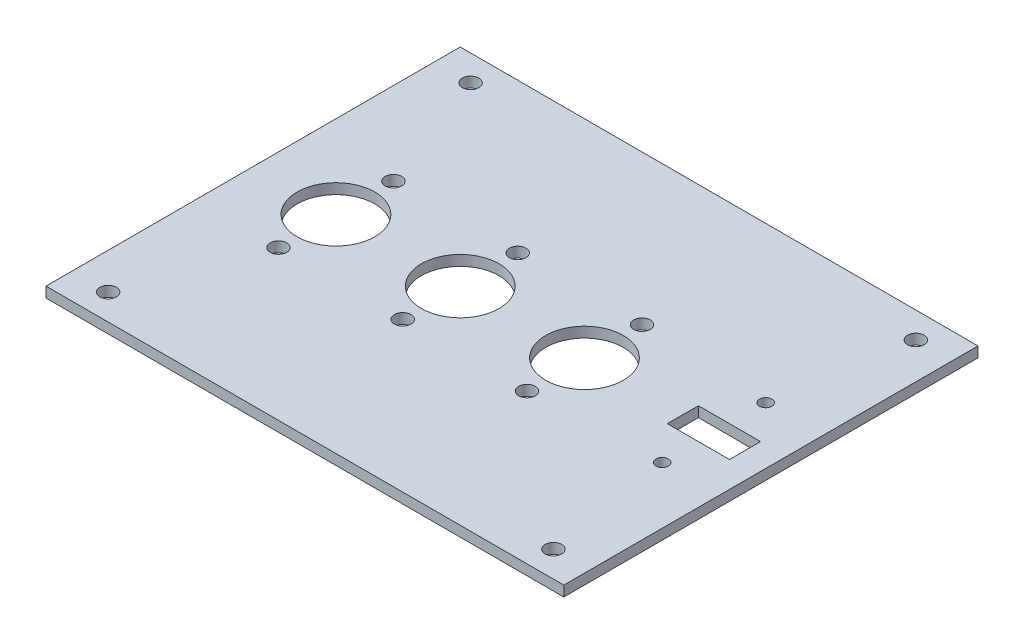
ISO-10303-21;
HEADER;
FILE_DESCRIPTION(('STEP AP214'),'2;1');
FILE_NAME('part.step','',(''),(''),'','','');
FILE_SCHEMA(('AUTOMOTIVE_DESIGN { 1 0 10303 214 1 1 1 1 }'));
ENDSEC;
DATA;
#1=APPLICATION_CONTEXT('core data for automotive mechanical design processes');
#2=APPLICATION_PROTOCOL_DEFINITION('international standard','automotive_design',2000,#1);
#3=PRODUCT_CONTEXT('',#1,'mechanical');
#4=PRODUCT('Part','Part','',(#3));
#5=PRODUCT_RELATED_PRODUCT_CATEGORY('part','',(#4));
#6=PRODUCT_DEFINITION_FORMATION('','',#4);
#7=PRODUCT_DEFINITION_CONTEXT('part definition',#1,'design');
#8=PRODUCT_DEFINITION('design','',#6,#7);
#9=PRODUCT_DEFINITION_SHAPE('','',#8);
#10=(LENGTH_UNIT() NAMED_UNIT(*) SI_UNIT(.MILLI.,.METRE.));
#11=(NAMED_UNIT(*) PLANE_ANGLE_UNIT() SI_UNIT($,.RADIAN.));
#12=(NAMED_UNIT(*) SI_UNIT($,.STERADIAN.) SOLID_ANGLE_UNIT());
#13=UNCERTAINTY_MEASURE_WITH_UNIT(LENGTH_MEASURE(1.E-05),#10,'distance_accuracy_value','');
#14=(GEOMETRIC_REPRESENTATION_CONTEXT(3) GLOBAL_UNCERTAINTY_ASSIGNED_CONTEXT((#13)) GLOBAL_UNIT_ASSIGNED_CONTEXT((#10,
#11,#12)) REPRESENTATION_CONTEXT('',''));
#15=CARTESIAN_POINT('',(0.,0.,0.));
#16=DIRECTION('',(0.,0.,1.));
#17=DIRECTION('',(1.,0.,0.));
#18=AXIS2_PLACEMENT_3D('',#15,#16,#17);
#19=CARTESIAN_POINT('',(0.,0.,80.));
#20=DIRECTION('',(0.,0.,1.));
#21=DIRECTION('',(1.,0.,0.));
#22=AXIS2_PLACEMENT_3D('',#19,#20,#21);
#23=PLANE('',#22);
#24=DIRECTION('',(-1.,0.,0.));
#25=VECTOR('',#24,1.);
#26=CARTESIAN_POINT('',(0.,-1.,80.));
#27=LINE('',#26,#25);
#28=CARTESIAN_POINT('',(50.,-1.,80.));
#29=VERTEX_POINT('',#28);
#30=CARTESIAN_POINT('',(-50.,-1.,80.));
#31=VERTEX_POINT('',#30);
#32=EDGE_CURVE('E84',#29,#31,#27,.T.);
#33=ORIENTED_EDGE('',*,*,#32,.F.);
#34=DIRECTION('',(0.,-1.,0.));
#35=VECTOR('',#34,1.);
#36=CARTESIAN_POINT('',(50.,0.,80.));
#37=LINE('',#36,#35);
#38=CARTESIAN_POINT('',(50.,1.,80.));
#39=VERTEX_POINT('',#38);
#40=EDGE_CURVE('E211',#39,#29,#37,.T.);
#41=ORIENTED_EDGE('',*,*,#40,.F.);
#42=DIRECTION('',(1.,0.,0.));
#43=VECTOR('',#42,1.);
#44=CARTESIAN_POINT('',(0.,1.,80.));
#45=LINE('',#44,#43);
#46=CARTESIAN_POINT('',(-50.,1.,80.));
#47=VERTEX_POINT('',#46);
#48=EDGE_CURVE('E214',#47,#39,#45,.T.);
#49=ORIENTED_EDGE('',*,*,#48,.F.);
#50=DIRECTION('',(0.,1.,0.));
#51=VECTOR('',#50,1.);
#52=CARTESIAN_POINT('',(-50.,0.,80.));
#53=LINE('',#52,#51);
#54=EDGE_CURVE('E216',#31,#47,#53,.T.);
#55=ORIENTED_EDGE('',*,*,#54,.F.);
#56=EDGE_LOOP('',(#33,#41,#49,#55));
#57=FACE_BOUND('',#56,.T.);
#58=ADVANCED_FACE('F16',(#57),#23,.T.);
#59=CARTESIAN_POINT('',(0.,-1.,0.));
#60=DIRECTION('',(0.,-1.,0.));
#61=DIRECTION('',(0.,0.,-1.));
#62=AXIS2_PLACEMENT_3D('',#59,#60,#61);
#63=PLANE('',#62);
#64=CARTESIAN_POINT('',(43.,-1.,75.));
#65=DIRECTION('',(0.,-1.,0.));
#66=DIRECTION('',(0.,0.,-1.));
#67=AXIS2_PLACEMENT_3D('',#64,#65,#66);
#68=CIRCLE('',#67,1.6);
#69=CARTESIAN_POINT('',(43.,-1.,73.4));
#70=VERTEX_POINT('',#69);
#71=EDGE_CURVE('E120',#70,#70,#68,.T.);
#72=ORIENTED_EDGE('',*,*,#71,.F.);
#73=EDGE_LOOP('',(#72));
#74=FACE_BOUND('',#73,.T.);
#75=CARTESIAN_POINT('',(43.,-1.,5.));
#76=DIRECTION('',(0.,-1.,0.));
#77=DIRECTION('',(0.,0.,-1.));
#78=AXIS2_PLACEMENT_3D('',#75,#76,#77);
#79=CIRCLE('',#78,1.6);
#80=CARTESIAN_POINT('',(43.,-1.,3.4));
#81=VERTEX_POINT('',#80);
#82=EDGE_CURVE('E117',#81,#81,#79,.T.);
#83=ORIENTED_EDGE('',*,*,#82,.F.);
#84=EDGE_LOOP('',(#83));
#85=FACE_BOUND('',#84,.T.);
#86=CARTESIAN_POINT('',(-43.,-1.,75.));
#87=DIRECTION('',(0.,-1.,0.));
#88=DIRECTION('',(0.,0.,-1.));
#89=AXIS2_PLACEMENT_3D('',#86,#87,#88);
#90=CIRCLE('',#89,1.6);
#91=CARTESIAN_POINT('',(-43.,-1.,73.4));
#92=VERTEX_POINT('',#91);
#93=EDGE_CURVE('E114',#92,#92,#90,.T.);
#94=ORIENTED_EDGE('',*,*,#93,.F.);
#95=EDGE_LOOP('',(#94));
#96=FACE_BOUND('',#95,.T.);
#97=CARTESIAN_POINT('',(-43.,-1.,5.));
#98=DIRECTION('',(0.,-1.,0.));
#99=DIRECTION('',(0.,0.,-1.));
#100=AXIS2_PLACEMENT_3D('',#97,#98,#99);
#101=CIRCLE('',#100,1.6);
#102=CARTESIAN_POINT('',(-43.,-1.,3.4));
#103=VERTEX_POINT('',#102);
#104=EDGE_CURVE('E110',#103,#103,#101,.T.);
#105=ORIENTED_EDGE('',*,*,#104,.F.);
#106=EDGE_LOOP('',(#105));
#107=FACE_BOUND('',#106,.T.);
#108=CARTESIAN_POINT('',(39.,-1.,50.));
#109=DIRECTION('',(0.,-1.,0.));
#110=DIRECTION('',(0.,0.,-1.));
#111=AXIS2_PLACEMENT_3D('',#108,#109,#110);
#112=CIRCLE('',#111,1.2);
#113=CARTESIAN_POINT('',(39.,-1.,48.8));
#114=VERTEX_POINT('',#113);
#115=EDGE_CURVE('E106',#114,#114,#112,.T.);
#116=ORIENTED_EDGE('',*,*,#115,.F.);
#117=EDGE_LOOP('',(#116));
#118=FACE_BOUND('',#117,.T.);
#119=CARTESIAN_POINT('',(39.,-1.,30.));
#120=DIRECTION('',(0.,-1.,0.));
#121=DIRECTION('',(0.,0.,-1.));
#122=AXIS2_PLACEMENT_3D('',#119,#120,#121);
#123=CIRCLE('',#122,1.2);
#124=CARTESIAN_POINT('',(39.,-1.,28.8));
#125=VERTEX_POINT('',#124);
#126=EDGE_CURVE('E105',#125,#125,#123,.T.);
#127=ORIENTED_EDGE('',*,*,#126,.F.);
#128=EDGE_LOOP('',(#127));
#129=FACE_BOUND('',#128,.T.);
#130=DIRECTION('',(-1.,0.,0.));
#131=VECTOR('',#130,1.);
#132=CARTESIAN_POINT('',(0.,-1.,43.));
#133=LINE('',#132,#131);
#134=CARTESIAN_POINT('',(45.,-1.,43.));
#135=VERTEX_POINT('',#134);
#136=CARTESIAN_POINT('',(33.,-1.,43.));
#137=VERTEX_POINT('',#136);
#138=EDGE_CURVE('E149',#135,#137,#133,.T.);
#139=ORIENTED_EDGE('',*,*,#138,.F.);
#140=DIRECTION('',(0.,0.,1.));
#141=VECTOR('',#140,1.);
#142=CARTESIAN_POINT('',(45.,-1.,0.));
#143=LINE('',#142,#141);
#144=CARTESIAN_POINT('',(45.,-1.,37.));
#145=VERTEX_POINT('',#144);
#146=EDGE_CURVE('E144',#145,#135,#143,.T.);
#147=ORIENTED_EDGE('',*,*,#146,.F.);
#148=DIRECTION('',(1.,0.,0.));
#149=VECTOR('',#148,1.);
#150=CARTESIAN_POINT('',(0.,-1.,37.));
#151=LINE('',#150,#149);
#152=CARTESIAN_POINT('',(33.,-1.,37.));
#153=VERTEX_POINT('',#152);
#154=EDGE_CURVE('E91',#153,#145,#151,.T.);
#155=ORIENTED_EDGE('',*,*,#154,.F.);
#156=DIRECTION('',(0.,0.,-1.));
#157=VECTOR('',#156,1.);
#158=CARTESIAN_POINT('',(33.,-1.,0.));
#159=LINE('',#158,#157);
#160=EDGE_CURVE('E147',#137,#153,#159,.T.);
#161=ORIENTED_EDGE('',*,*,#160,.F.);
#162=EDGE_LOOP('',(#139,#147,#155,#161));
#163=FACE_BOUND('',#162,.T.);
#164=CARTESIAN_POINT('',(14.,-1.,51.1));
#165=DIRECTION('',(0.,-1.,0.));
#166=DIRECTION('',(0.,0.,-1.));
#167=AXIS2_PLACEMENT_3D('',#164,#165,#166);
#168=CIRCLE('',#167,1.6);
#169=CARTESIAN_POINT('',(14.,-1.,49.5));
#170=VERTEX_POINT('',#169);
#171=EDGE_CURVE('E152',#170,#170,#168,.T.);
#172=ORIENTED_EDGE('',*,*,#171,.F.);
#173=EDGE_LOOP('',(#172));
#174=FACE_BOUND('',#173,.T.);
#175=CARTESIAN_POINT('',(14.,-1.,28.9));
#176=DIRECTION('',(0.,-1.,0.));
#177=DIRECTION('',(0.,0.,-1.));
#178=AXIS2_PLACEMENT_3D('',#175,#176,#177);
#179=CIRCLE('',#178,1.6);
#180=CARTESIAN_POINT('',(14.,-1.,27.3));
#181=VERTEX_POINT('',#180);
#182=EDGE_CURVE('E156',#181,#181,#179,.T.);
#183=ORIENTED_EDGE('',*,*,#182,.F.);
#184=EDGE_LOOP('',(#183));
#185=FACE_BOUND('',#184,.T.);
#186=CARTESIAN_POINT('',(14.,-1.,40.));
#187=DIRECTION('',(0.,-1.,0.));
#188=DIRECTION('',(0.,0.,-1.));
#189=AXIS2_PLACEMENT_3D('',#186,#187,#188);
#190=CIRCLE('',#189,7.5);
#191=CARTESIAN_POINT('',(14.,-1.,32.5));
#192=VERTEX_POINT('',#191);
#193=EDGE_CURVE('E160',#192,#192,#190,.T.);
#194=ORIENTED_EDGE('',*,*,#193,.F.);
#195=EDGE_LOOP('',(#194));
#196=FACE_BOUND('',#195,.T.);
#197=CARTESIAN_POINT('',(-10.,-1.,51.1));
#198=DIRECTION('',(0.,-1.,0.));
#199=DIRECTION('',(0.,0.,-1.));
#200=AXIS2_PLACEMENT_3D('',#197,#198,#199);
#201=CIRCLE('',#200,1.6);
#202=CARTESIAN_POINT('',(-10.,-1.,49.5));
#203=VERTEX_POINT('',#202);
#204=EDGE_CURVE('E164',#203,#203,#201,.T.);
#205=ORIENTED_EDGE('',*,*,#204,.F.);
#206=EDGE_LOOP('',(#205));
#207=FACE_BOUND('',#206,.T.);
#208=CARTESIAN_POINT('',(-10.,-1.,28.9));
#209=DIRECTION('',(0.,-1.,0.));
#210=DIRECTION('',(0.,0.,-1.));
#211=AXIS2_PLACEMENT_3D('',#208,#209,#210);
#212=CIRCLE('',#211,1.6);
#213=CARTESIAN_POINT('',(-10.,-1.,27.3));
#214=VERTEX_POINT('',#213);
#215=EDGE_CURVE('E168',#214,#214,#212,.T.);
#216=ORIENTED_EDGE('',*,*,#215,.F.);
#217=EDGE_LOOP('',(#216));
#218=FACE_BOUND('',#217,.T.);
#219=CARTESIAN_POINT('',(-10.,-1.,40.));
#220=DIRECTION('',(0.,-1.,0.));
#221=DIRECTION('',(0.,0.,-1.));
#222=AXIS2_PLACEMENT_3D('',#219,#220,#221);
#223=CIRCLE('',#222,7.5);
#224=CARTESIAN_POINT('',(-10.,-1.,32.5));
#225=VERTEX_POINT('',#224);
#226=EDGE_CURVE('E172',#225,#225,#223,.T.);
#227=ORIENTED_EDGE('',*,*,#226,.F.);
#228=EDGE_LOOP('',(#227));
#229=FACE_BOUND('',#228,.T.);
#230=CARTESIAN_POINT('',(-34.,-1.,51.1));
#231=DIRECTION('',(0.,-1.,0.));
#232=DIRECTION('',(0.,0.,-1.));
#233=AXIS2_PLACEMENT_3D('',#230,#231,#232);
#234=CIRCLE('',#233,1.6);
#235=CARTESIAN_POINT('',(-34.,-1.,49.5));
#236=VERTEX_POINT('',#235);
#237=EDGE_CURVE('E176',#236,#236,#234,.T.);
#238=ORIENTED_EDGE('',*,*,#237,.F.);
#239=EDGE_LOOP('',(#238));
#240=FACE_BOUND('',#239,.T.);
#241=CARTESIAN_POINT('',(-34.,-1.,28.9));
#242=DIRECTION('',(0.,-1.,0.));
#243=DIRECTION('',(0.,0.,-1.));
#244=AXIS2_PLACEMENT_3D('',#241,#242,#243);
#245=CIRCLE('',#244,1.6);
#246=CARTESIAN_POINT('',(-34.,-1.,27.3));
#247=VERTEX_POINT('',#246);
#248=EDGE_CURVE('E180',#247,#247,#245,.T.);
#249=ORIENTED_EDGE('',*,*,#248,.F.);
#250=EDGE_LOOP('',(#249));
#251=FACE_BOUND('',#250,.T.);
#252=CARTESIAN_POINT('',(-34.,-1.,40.));
#253=DIRECTION('',(0.,-1.,0.));
#254=DIRECTION('',(0.,0.,-1.));
#255=AXIS2_PLACEMENT_3D('',#252,#253,#254);
#256=CIRCLE('',#255,7.5);
#257=CARTESIAN_POINT('',(-34.,-1.,32.5));
#258=VERTEX_POINT('',#257);
#259=EDGE_CURVE('E184',#258,#258,#256,.T.);
#260=ORIENTED_EDGE('',*,*,#259,.F.);
#261=EDGE_LOOP('',(#260));
#262=FACE_BOUND('',#261,.T.);
#263=DIRECTION('',(0.,0.,1.));
#264=VECTOR('',#263,1.);
#265=CARTESIAN_POINT('',(50.,-1.,0.));
#266=LINE('',#265,#264);
#267=CARTESIAN_POINT('',(50.,-1.,0.));
#268=VERTEX_POINT('',#267);
#269=EDGE_CURVE('E194',#268,#29,#266,.T.);
#270=ORIENTED_EDGE('',*,*,#269,.T.);
#271=ORIENTED_EDGE('',*,*,#32,.T.);
#272=DIRECTION('',(0.,0.,1.));
#273=VECTOR('',#272,1.);
#274=CARTESIAN_POINT('',(-50.,-1.,0.));
#275=LINE('',#274,#273);
#276=CARTESIAN_POINT('',(-50.,-1.,0.));
#277=VERTEX_POINT('',#276);
#278=EDGE_CURVE('E208',#277,#31,#275,.T.);
#279=ORIENTED_EDGE('',*,*,#278,.F.);
#280=DIRECTION('',(1.,0.,0.));
#281=VECTOR('',#280,1.);
#282=CARTESIAN_POINT('',(0.,-1.,0.));
#283=LINE('',#282,#281);
#284=EDGE_CURVE('E187',#277,#268,#283,.T.);
#285=ORIENTED_EDGE('',*,*,#284,.T.);
#286=EDGE_LOOP('',(#270,#271,#279,#285));
#287=FACE_BOUND('',#286,.T.);
#288=ADVANCED_FACE('F273',(#74,#85,#96,#107,#118,#129,#163,#174,#185,#196,#207,#218,#229,#240,
#251,#262,#287),#63,.T.);
#289=CARTESIAN_POINT('',(-50.,0.,0.));
#290=DIRECTION('',(-1.,0.,0.));
#291=DIRECTION('',(0.,0.,1.));
#292=AXIS2_PLACEMENT_3D('',#289,#290,#291);
#293=PLANE('',#292);
#294=ORIENTED_EDGE('',*,*,#278,.T.);
#295=ORIENTED_EDGE('',*,*,#54,.T.);
#296=DIRECTION('',(0.,0.,1.));
#297=VECTOR('',#296,1.);
#298=CARTESIAN_POINT('',(-50.,1.,0.));
#299=LINE('',#298,#297);
#300=CARTESIAN_POINT('',(-50.,1.,0.));
#301=VERTEX_POINT('',#300);
#302=EDGE_CURVE('E205',#301,#47,#299,.T.);
#303=ORIENTED_EDGE('',*,*,#302,.F.);
#304=DIRECTION('',(0.,-1.,0.));
#305=VECTOR('',#304,1.);
#306=CARTESIAN_POINT('',(-50.,0.,0.));
#307=LINE('',#306,#305);
#308=EDGE_CURVE('E190',#301,#277,#307,.T.);
#309=ORIENTED_EDGE('',*,*,#308,.T.);
#310=EDGE_LOOP('',(#294,#295,#303,#309));
#311=FACE_BOUND('',#310,.T.);
#312=ADVANCED_FACE('F241',(#311),#293,.T.);
#313=CARTESIAN_POINT('',(0.,1.,0.));
#314=DIRECTION('',(0.,1.,0.));
#315=DIRECTION('',(0.,0.,1.));
#316=AXIS2_PLACEMENT_3D('',#313,#314,#315);
#317=PLANE('',#316);
#318=CARTESIAN_POINT('',(43.,1.,75.));
#319=DIRECTION('',(0.,1.,0.));
#320=DIRECTION('',(0.,0.,1.));
#321=AXIS2_PLACEMENT_3D('',#318,#319,#320);
#322=CIRCLE('',#321,1.6);
#323=CARTESIAN_POINT('',(43.,1.,76.6));
#324=VERTEX_POINT('',#323);
#325=EDGE_CURVE('E19',#324,#324,#322,.T.);
#326=ORIENTED_EDGE('',*,*,#325,.F.);
#327=EDGE_LOOP('',(#326));
#328=FACE_BOUND('',#327,.T.);
#329=CARTESIAN_POINT('',(43.,1.,5.));
#330=DIRECTION('',(0.,1.,0.));
#331=DIRECTION('',(0.,0.,1.));
#332=AXIS2_PLACEMENT_3D('',#329,#330,#331);
#333=CIRCLE('',#332,1.6);
#334=CARTESIAN_POINT('',(43.,1.,6.6));
#335=VERTEX_POINT('',#334);
#336=EDGE_CURVE('E118',#335,#335,#333,.T.);
#337=ORIENTED_EDGE('',*,*,#336,.F.);
#338=EDGE_LOOP('',(#337));
#339=FACE_BOUND('',#338,.T.);
#340=CARTESIAN_POINT('',(-43.,1.,75.));
#341=DIRECTION('',(0.,1.,0.));
#342=DIRECTION('',(0.,0.,1.));
#343=AXIS2_PLACEMENT_3D('',#340,#341,#342);
#344=CIRCLE('',#343,1.6);
#345=CARTESIAN_POINT('',(-43.,1.,76.6));
#346=VERTEX_POINT('',#345);
#347=EDGE_CURVE('E115',#346,#346,#344,.T.);
#348=ORIENTED_EDGE('',*,*,#347,.F.);
#349=EDGE_LOOP('',(#348));
#350=FACE_BOUND('',#349,.T.);
#351=CARTESIAN_POINT('',(-43.,1.,5.));
#352=DIRECTION('',(0.,1.,0.));
#353=DIRECTION('',(0.,0.,1.));
#354=AXIS2_PLACEMENT_3D('',#351,#352,#353);
#355=CIRCLE('',#354,1.6);
#356=CARTESIAN_POINT('',(-43.,1.,6.6));
#357=VERTEX_POINT('',#356);
#358=EDGE_CURVE('E111',#357,#357,#355,.T.);
#359=ORIENTED_EDGE('',*,*,#358,.F.);
#360=EDGE_LOOP('',(#359));
#361=FACE_BOUND('',#360,.T.);
#362=CARTESIAN_POINT('',(39.,1.,50.));
#363=DIRECTION('',(0.,1.,0.));
#364=DIRECTION('',(0.,0.,1.));
#365=AXIS2_PLACEMENT_3D('',#362,#363,#364);
#366=CIRCLE('',#365,1.2);
#367=CARTESIAN_POINT('',(39.,1.,51.2));
#368=VERTEX_POINT('',#367);
#369=EDGE_CURVE('E107',#368,#368,#366,.T.);
#370=ORIENTED_EDGE('',*,*,#369,.F.);
#371=EDGE_LOOP('',(#370));
#372=FACE_BOUND('',#371,.T.);
#373=CARTESIAN_POINT('',(39.,1.,30.));
#374=DIRECTION('',(0.,1.,0.));
#375=DIRECTION('',(0.,0.,1.));
#376=AXIS2_PLACEMENT_3D('',#373,#374,#375);
#377=CIRCLE('',#376,1.2);
#378=CARTESIAN_POINT('',(39.,1.,31.2));
#379=VERTEX_POINT('',#378);
#380=EDGE_CURVE('E102',#379,#379,#377,.T.);
#381=ORIENTED_EDGE('',*,*,#380,.F.);
#382=EDGE_LOOP('',(#381));
#383=FACE_BOUND('',#382,.T.);
#384=DIRECTION('',(1.,0.,0.));
#385=VECTOR('',#384,1.);
#386=CARTESIAN_POINT('',(0.,1.,43.));
#387=LINE('',#386,#385);
#388=CARTESIAN_POINT('',(33.,1.,43.));
#389=VERTEX_POINT('',#388);
#390=CARTESIAN_POINT('',(45.,1.,43.));
#391=VERTEX_POINT('',#390);
#392=EDGE_CURVE('E10',#389,#391,#387,.T.);
#393=ORIENTED_EDGE('',*,*,#392,.F.);
#394=DIRECTION('',(0.,0.,1.));
#395=VECTOR('',#394,1.);
#396=CARTESIAN_POINT('',(33.,1.,0.));
#397=LINE('',#396,#395);
#398=CARTESIAN_POINT('',(33.,1.,37.));
#399=VERTEX_POINT('',#398);
#400=EDGE_CURVE('E24',#399,#389,#397,.T.);
#401=ORIENTED_EDGE('',*,*,#400,.F.);
#402=DIRECTION('',(-1.,0.,0.));
#403=VECTOR('',#402,1.);
#404=CARTESIAN_POINT('',(0.,1.,37.));
#405=LINE('',#404,#403);
#406=CARTESIAN_POINT('',(45.,1.,37.));
#407=VERTEX_POINT('',#406);
#408=EDGE_CURVE('E83',#407,#399,#405,.T.);
#409=ORIENTED_EDGE('',*,*,#408,.F.);
#410=DIRECTION('',(0.,0.,-1.));
#411=VECTOR('',#410,1.);
#412=CARTESIAN_POINT('',(45.,1.,0.));
#413=LINE('',#412,#411);
#414=EDGE_CURVE('E78',#391,#407,#413,.T.);
#415=ORIENTED_EDGE('',*,*,#414,.F.);
#416=EDGE_LOOP('',(#393,#401,#409,#415));
#417=FACE_BOUND('',#416,.T.);
#418=CARTESIAN_POINT('',(14.,1.,51.1));
#419=DIRECTION('',(0.,1.,0.));
#420=DIRECTION('',(0.,0.,1.));
#421=AXIS2_PLACEMENT_3D('',#418,#419,#420);
#422=CIRCLE('',#421,1.6);
#423=CARTESIAN_POINT('',(14.,1.,52.7));
#424=VERTEX_POINT('',#423);
#425=EDGE_CURVE('E151',#424,#424,#422,.T.);
#426=ORIENTED_EDGE('',*,*,#425,.F.);
#427=EDGE_LOOP('',(#426));
#428=FACE_BOUND('',#427,.T.);
#429=CARTESIAN_POINT('',(14.,1.,28.9));
#430=DIRECTION('',(0.,1.,0.));
#431=DIRECTION('',(0.,0.,1.));
#432=AXIS2_PLACEMENT_3D('',#429,#430,#431);
#433=CIRCLE('',#432,1.6);
#434=CARTESIAN_POINT('',(14.,1.,30.5));
#435=VERTEX_POINT('',#434);
#436=EDGE_CURVE('E155',#435,#435,#433,.T.);
#437=ORIENTED_EDGE('',*,*,#436,.F.);
#438=EDGE_LOOP('',(#437));
#439=FACE_BOUND('',#438,.T.);
#440=CARTESIAN_POINT('',(14.,1.,40.));
#441=DIRECTION('',(0.,1.,0.));
#442=DIRECTION('',(0.,0.,1.));
#443=AXIS2_PLACEMENT_3D('',#440,#441,#442);
#444=CIRCLE('',#443,7.5);
#445=CARTESIAN_POINT('',(14.,1.,47.5));
#446=VERTEX_POINT('',#445);
#447=EDGE_CURVE('E159',#446,#446,#444,.T.);
#448=ORIENTED_EDGE('',*,*,#447,.F.);
#449=EDGE_LOOP('',(#448));
#450=FACE_BOUND('',#449,.T.);
#451=CARTESIAN_POINT('',(-10.,1.,51.1));
#452=DIRECTION('',(0.,1.,0.));
#453=DIRECTION('',(0.,0.,1.));
#454=AXIS2_PLACEMENT_3D('',#451,#452,#453);
#455=CIRCLE('',#454,1.6);
#456=CARTESIAN_POINT('',(-10.,1.,52.7));
#457=VERTEX_POINT('',#456);
#458=EDGE_CURVE('E163',#457,#457,#455,.T.);
#459=ORIENTED_EDGE('',*,*,#458,.F.);
#460=EDGE_LOOP('',(#459));
#461=FACE_BOUND('',#460,.T.);
#462=CARTESIAN_POINT('',(-10.,1.,28.9));
#463=DIRECTION('',(0.,1.,0.));
#464=DIRECTION('',(0.,0.,1.));
#465=AXIS2_PLACEMENT_3D('',#462,#463,#464);
#466=CIRCLE('',#465,1.6);
#467=CARTESIAN_POINT('',(-10.,1.,30.5));
#468=VERTEX_POINT('',#467);
#469=EDGE_CURVE('E167',#468,#468,#466,.T.);
#470=ORIENTED_EDGE('',*,*,#469,.F.);
#471=EDGE_LOOP('',(#470));
#472=FACE_BOUND('',#471,.T.);
#473=CARTESIAN_POINT('',(-10.,1.,40.));
#474=DIRECTION('',(0.,1.,0.));
#475=DIRECTION('',(0.,0.,1.));
#476=AXIS2_PLACEMENT_3D('',#473,#474,#475);
#477=CIRCLE('',#476,7.5);
#478=CARTESIAN_POINT('',(-10.,1.,47.5));
#479=VERTEX_POINT('',#478);
#480=EDGE_CURVE('E171',#479,#479,#477,.T.);
#481=ORIENTED_EDGE('',*,*,#480,.F.);
#482=EDGE_LOOP('',(#481));
#483=FACE_BOUND('',#482,.T.);
#484=CARTESIAN_POINT('',(-34.,1.,51.1));
#485=DIRECTION('',(0.,1.,0.));
#486=DIRECTION('',(0.,0.,1.));
#487=AXIS2_PLACEMENT_3D('',#484,#485,#486);
#488=CIRCLE('',#487,1.6);
#489=CARTESIAN_POINT('',(-34.,1.,52.7));
#490=VERTEX_POINT('',#489);
#491=EDGE_CURVE('E175',#490,#490,#488,.T.);
#492=ORIENTED_EDGE('',*,*,#491,.F.);
#493=EDGE_LOOP('',(#492));
#494=FACE_BOUND('',#493,.T.);
#495=CARTESIAN_POINT('',(-34.,1.,28.9));
#496=DIRECTION('',(0.,1.,0.));
#497=DIRECTION('',(0.,0.,1.));
#498=AXIS2_PLACEMENT_3D('',#495,#496,#497);
#499=CIRCLE('',#498,1.6);
#500=CARTESIAN_POINT('',(-34.,1.,30.5));
#501=VERTEX_POINT('',#500);
#502=EDGE_CURVE('E179',#501,#501,#499,.T.);
#503=ORIENTED_EDGE('',*,*,#502,.F.);
#504=EDGE_LOOP('',(#503));
#505=FACE_BOUND('',#504,.T.);
#506=CARTESIAN_POINT('',(-34.,1.,40.));
#507=DIRECTION('',(0.,1.,0.));
#508=DIRECTION('',(0.,0.,1.));
#509=AXIS2_PLACEMENT_3D('',#506,#507,#508);
#510=CIRCLE('',#509,7.5);
#511=CARTESIAN_POINT('',(-34.,1.,47.5));
#512=VERTEX_POINT('',#511);
#513=EDGE_CURVE('E183',#512,#512,#510,.T.);
#514=ORIENTED_EDGE('',*,*,#513,.F.);
#515=EDGE_LOOP('',(#514));
#516=FACE_BOUND('',#515,.T.);
#517=ORIENTED_EDGE('',*,*,#302,.T.);
#518=ORIENTED_EDGE('',*,*,#48,.T.);
#519=DIRECTION('',(0.,0.,1.));
#520=VECTOR('',#519,1.);
#521=CARTESIAN_POINT('',(50.,1.,0.));
#522=LINE('',#521,#520);
#523=CARTESIAN_POINT('',(50.,1.,0.));
#524=VERTEX_POINT('',#523);
#525=EDGE_CURVE('E202',#524,#39,#522,.T.);
#526=ORIENTED_EDGE('',*,*,#525,.F.);
#527=DIRECTION('',(-1.,0.,0.));
#528=VECTOR('',#527,1.);
#529=CARTESIAN_POINT('',(0.,1.,0.));
#530=LINE('',#529,#528);
#531=EDGE_CURVE('E195',#524,#301,#530,.T.);
#532=ORIENTED_EDGE('',*,*,#531,.T.);
#533=EDGE_LOOP('',(#517,#518,#526,#532));
#534=FACE_BOUND('',#533,.T.);
#535=ADVANCED_FACE('F96',(#328,#339,#350,#361,#372,#383,#417,#428,#439,#450,#461,#472,#483,#494,
#505,#516,#534),#317,.T.);
#536=CARTESIAN_POINT('',(0.,0.,0.));
#537=DIRECTION('',(0.,0.,-1.));
#538=DIRECTION('',(-1.,0.,0.));
#539=AXIS2_PLACEMENT_3D('',#536,#537,#538);
#540=PLANE('',#539);
#541=DIRECTION('',(0.,1.,0.));
#542=VECTOR('',#541,1.);
#543=CARTESIAN_POINT('',(50.,0.,0.));
#544=LINE('',#543,#542);
#545=EDGE_CURVE('E191',#268,#524,#544,.T.);
#546=ORIENTED_EDGE('',*,*,#545,.F.);
#547=ORIENTED_EDGE('',*,*,#284,.F.);
#548=ORIENTED_EDGE('',*,*,#308,.F.);
#549=ORIENTED_EDGE('',*,*,#531,.F.);
#550=EDGE_LOOP('',(#546,#547,#548,#549));
#551=FACE_BOUND('',#550,.T.);
#552=ADVANCED_FACE('F240',(#551),#540,.T.);
#553=CARTESIAN_POINT('',(50.,0.,0.));
#554=DIRECTION('',(1.,0.,0.));
#555=DIRECTION('',(0.,0.,-1.));
#556=AXIS2_PLACEMENT_3D('',#553,#554,#555);
#557=PLANE('',#556);
#558=ORIENTED_EDGE('',*,*,#545,.T.);
#559=ORIENTED_EDGE('',*,*,#525,.T.);
#560=ORIENTED_EDGE('',*,*,#40,.T.);
#561=ORIENTED_EDGE('',*,*,#269,.F.);
#562=EDGE_LOOP('',(#558,#559,#560,#561));
#563=FACE_BOUND('',#562,.T.);
#564=ADVANCED_FACE('F269',(#563),#557,.T.);
#565=CARTESIAN_POINT('',(-34.,-1.4,40.));
#566=DIRECTION('',(0.,1.,0.));
#567=DIRECTION('',(0.,0.,1.));
#568=AXIS2_PLACEMENT_3D('',#565,#566,#567);
#569=CYLINDRICAL_SURFACE('',#568,7.5);
#570=ORIENTED_EDGE('',*,*,#259,.T.);
#571=EDGE_LOOP('',(#570));
#572=FACE_BOUND('',#571,.T.);
#573=ORIENTED_EDGE('',*,*,#513,.T.);
#574=EDGE_LOOP('',(#573));
#575=FACE_BOUND('',#574,.T.);
#576=ADVANCED_FACE('F286',(#572,#575),#569,.F.);
#577=CARTESIAN_POINT('',(-34.,-1.4,28.9));
#578=DIRECTION('',(0.,1.,0.));
#579=DIRECTION('',(0.,0.,1.));
#580=AXIS2_PLACEMENT_3D('',#577,#578,#579);
#581=CYLINDRICAL_SURFACE('',#580,1.6);
#582=ORIENTED_EDGE('',*,*,#248,.T.);
#583=EDGE_LOOP('',(#582));
#584=FACE_BOUND('',#583,.T.);
#585=ORIENTED_EDGE('',*,*,#502,.T.);
#586=EDGE_LOOP('',(#585));
#587=FACE_BOUND('',#586,.T.);
#588=ADVANCED_FACE('F291',(#584,#587),#581,.F.);
#589=CARTESIAN_POINT('',(-34.,-1.4,51.1));
#590=DIRECTION('',(0.,1.,0.));
#591=DIRECTION('',(0.,0.,1.));
#592=AXIS2_PLACEMENT_3D('',#589,#590,#591);
#593=CYLINDRICAL_SURFACE('',#592,1.6);
#594=ORIENTED_EDGE('',*,*,#237,.T.);
#595=EDGE_LOOP('',(#594));
#596=FACE_BOUND('',#595,.T.);
#597=ORIENTED_EDGE('',*,*,#491,.T.);
#598=EDGE_LOOP('',(#597));
#599=FACE_BOUND('',#598,.T.);
#600=ADVANCED_FACE('F295',(#596,#599),#593,.F.);
#601=CARTESIAN_POINT('',(-10.,-1.4,40.));
#602=DIRECTION('',(0.,1.,0.));
#603=DIRECTION('',(0.,0.,1.));
#604=AXIS2_PLACEMENT_3D('',#601,#602,#603);
#605=CYLINDRICAL_SURFACE('',#604,7.5);
#606=ORIENTED_EDGE('',*,*,#226,.T.);
#607=EDGE_LOOP('',(#606));
#608=FACE_BOUND('',#607,.T.);
#609=ORIENTED_EDGE('',*,*,#480,.T.);
#610=EDGE_LOOP('',(#609));
#611=FACE_BOUND('',#610,.T.);
#612=ADVANCED_FACE('F299',(#608,#611),#605,.F.);
#613=CARTESIAN_POINT('',(-10.,-1.4,28.9));
#614=DIRECTION('',(0.,1.,0.));
#615=DIRECTION('',(0.,0.,1.));
#616=AXIS2_PLACEMENT_3D('',#613,#614,#615);
#617=CYLINDRICAL_SURFACE('',#616,1.6);
#618=ORIENTED_EDGE('',*,*,#215,.T.);
#619=EDGE_LOOP('',(#618));
#620=FACE_BOUND('',#619,.T.);
#621=ORIENTED_EDGE('',*,*,#469,.T.);
#622=EDGE_LOOP('',(#621));
#623=FACE_BOUND('',#622,.T.);
#624=ADVANCED_FACE('F303',(#620,#623),#617,.F.);
#625=CARTESIAN_POINT('',(-10.,-1.4,51.1));
#626=DIRECTION('',(0.,1.,0.));
#627=DIRECTION('',(0.,0.,1.));
#628=AXIS2_PLACEMENT_3D('',#625,#626,#627);
#629=CYLINDRICAL_SURFACE('',#628,1.6);
#630=ORIENTED_EDGE('',*,*,#204,.T.);
#631=EDGE_LOOP('',(#630));
#632=FACE_BOUND('',#631,.T.);
#633=ORIENTED_EDGE('',*,*,#458,.T.);
#634=EDGE_LOOP('',(#633));
#635=FACE_BOUND('',#634,.T.);
#636=ADVANCED_FACE('F307',(#632,#635),#629,.F.);
#637=CARTESIAN_POINT('',(14.,-1.4,40.));
#638=DIRECTION('',(0.,1.,0.));
#639=DIRECTION('',(0.,0.,1.));
#640=AXIS2_PLACEMENT_3D('',#637,#638,#639);
#641=CYLINDRICAL_SURFACE('',#640,7.5);
#642=ORIENTED_EDGE('',*,*,#193,.T.);
#643=EDGE_LOOP('',(#642));
#644=FACE_BOUND('',#643,.T.);
#645=ORIENTED_EDGE('',*,*,#447,.T.);
#646=EDGE_LOOP('',(#645));
#647=FACE_BOUND('',#646,.T.);
#648=ADVANCED_FACE('F311',(#644,#647),#641,.F.);
#649=CARTESIAN_POINT('',(14.,-1.4,28.9));
#650=DIRECTION('',(0.,1.,0.));
#651=DIRECTION('',(0.,0.,1.));
#652=AXIS2_PLACEMENT_3D('',#649,#650,#651);
#653=CYLINDRICAL_SURFACE('',#652,1.6);
#654=ORIENTED_EDGE('',*,*,#182,.T.);
#655=EDGE_LOOP('',(#654));
#656=FACE_BOUND('',#655,.T.);
#657=ORIENTED_EDGE('',*,*,#436,.T.);
#658=EDGE_LOOP('',(#657));
#659=FACE_BOUND('',#658,.T.);
#660=ADVANCED_FACE('F315',(#656,#659),#653,.F.);
#661=CARTESIAN_POINT('',(14.,-1.4,51.1));
#662=DIRECTION('',(0.,1.,0.));
#663=DIRECTION('',(0.,0.,1.));
#664=AXIS2_PLACEMENT_3D('',#661,#662,#663);
#665=CYLINDRICAL_SURFACE('',#664,1.6);
#666=ORIENTED_EDGE('',*,*,#171,.T.);
#667=EDGE_LOOP('',(#666));
#668=FACE_BOUND('',#667,.T.);
#669=ORIENTED_EDGE('',*,*,#425,.T.);
#670=EDGE_LOOP('',(#669));
#671=FACE_BOUND('',#670,.T.);
#672=ADVANCED_FACE('F237',(#668,#671),#665,.F.);
#673=CARTESIAN_POINT('',(39.,0.,43.));
#674=DIRECTION('',(0.,0.,1.));
#675=DIRECTION('',(1.,0.,0.));
#676=AXIS2_PLACEMENT_3D('',#673,#674,#675);
#677=PLANE('',#676);
#678=ORIENTED_EDGE('',*,*,#138,.T.);
#679=DIRECTION('',(0.,1.,0.));
#680=VECTOR('',#679,1.);
#681=CARTESIAN_POINT('',(33.,0.,43.));
#682=LINE('',#681,#680);
#683=EDGE_CURVE('E141',#137,#389,#682,.T.);
#684=ORIENTED_EDGE('',*,*,#683,.T.);
#685=ORIENTED_EDGE('',*,*,#392,.T.);
#686=DIRECTION('',(0.,-1.,0.));
#687=VECTOR('',#686,1.);
#688=CARTESIAN_POINT('',(45.,0.,43.));
#689=LINE('',#688,#687);
#690=EDGE_CURVE('E37',#391,#135,#689,.T.);
#691=ORIENTED_EDGE('',*,*,#690,.T.);
#692=EDGE_LOOP('',(#678,#684,#685,#691));
#693=FACE_BOUND('',#692,.T.);
#694=ADVANCED_FACE('F322',(#693),#677,.F.);
#695=CARTESIAN_POINT('',(33.,0.,37.));
#696=DIRECTION('',(-1.,0.,0.));
#697=DIRECTION('',(0.,0.,1.));
#698=AXIS2_PLACEMENT_3D('',#695,#696,#697);
#699=PLANE('',#698);
#700=ORIENTED_EDGE('',*,*,#160,.T.);
#701=DIRECTION('',(0.,-1.,0.));
#702=VECTOR('',#701,1.);
#703=CARTESIAN_POINT('',(33.,0.,37.));
#704=LINE('',#703,#702);
#705=EDGE_CURVE('E93',#399,#153,#704,.T.);
#706=ORIENTED_EDGE('',*,*,#705,.F.);
#707=ORIENTED_EDGE('',*,*,#400,.T.);
#708=ORIENTED_EDGE('',*,*,#683,.F.);
#709=EDGE_LOOP('',(#700,#706,#707,#708));
#710=FACE_BOUND('',#709,.T.);
#711=ADVANCED_FACE('F326',(#710),#699,.F.);
#712=CARTESIAN_POINT('',(39.,0.,37.));
#713=DIRECTION('',(0.,0.,-1.));
#714=DIRECTION('',(-1.,0.,0.));
#715=AXIS2_PLACEMENT_3D('',#712,#713,#714);
#716=PLANE('',#715);
#717=ORIENTED_EDGE('',*,*,#154,.T.);
#718=DIRECTION('',(0.,1.,0.));
#719=VECTOR('',#718,1.);
#720=CARTESIAN_POINT('',(45.,0.,37.));
#721=LINE('',#720,#719);
#722=EDGE_CURVE('E32',#145,#407,#721,.T.);
#723=ORIENTED_EDGE('',*,*,#722,.T.);
#724=ORIENTED_EDGE('',*,*,#408,.T.);
#725=ORIENTED_EDGE('',*,*,#705,.T.);
#726=EDGE_LOOP('',(#717,#723,#724,#725));
#727=FACE_BOUND('',#726,.T.);
#728=ADVANCED_FACE('F87',(#727),#716,.F.);
#729=CARTESIAN_POINT('',(45.,0.,37.));
#730=DIRECTION('',(1.,0.,0.));
#731=DIRECTION('',(0.,0.,-1.));
#732=AXIS2_PLACEMENT_3D('',#729,#730,#731);
#733=PLANE('',#732);
#734=ORIENTED_EDGE('',*,*,#146,.T.);
#735=ORIENTED_EDGE('',*,*,#690,.F.);
#736=ORIENTED_EDGE('',*,*,#414,.T.);
#737=ORIENTED_EDGE('',*,*,#722,.F.);
#738=EDGE_LOOP('',(#734,#735,#736,#737));
#739=FACE_BOUND('',#738,.T.);
#740=ADVANCED_FACE('F79',(#739),#733,.F.);
#741=CARTESIAN_POINT('',(39.,-1.4,30.));
#742=DIRECTION('',(0.,1.,0.));
#743=DIRECTION('',(0.,0.,1.));
#744=AXIS2_PLACEMENT_3D('',#741,#742,#743);
#745=CYLINDRICAL_SURFACE('',#744,1.2);
#746=ORIENTED_EDGE('',*,*,#126,.T.);
#747=EDGE_LOOP('',(#746));
#748=FACE_BOUND('',#747,.T.);
#749=ORIENTED_EDGE('',*,*,#380,.T.);
#750=EDGE_LOOP('',(#749));
#751=FACE_BOUND('',#750,.T.);
#752=ADVANCED_FACE('F333',(#748,#751),#745,.F.);
#753=CARTESIAN_POINT('',(39.,-1.4,50.));
#754=DIRECTION('',(0.,1.,0.));
#755=DIRECTION('',(0.,0.,1.));
#756=AXIS2_PLACEMENT_3D('',#753,#754,#755);
#757=CYLINDRICAL_SURFACE('',#756,1.2);
#758=ORIENTED_EDGE('',*,*,#115,.T.);
#759=EDGE_LOOP('',(#758));
#760=FACE_BOUND('',#759,.T.);
#761=ORIENTED_EDGE('',*,*,#369,.T.);
#762=EDGE_LOOP('',(#761));
#763=FACE_BOUND('',#762,.T.);
#764=ADVANCED_FACE('F338',(#760,#763),#757,.F.);
#765=CARTESIAN_POINT('',(-43.,-1.4,5.));
#766=DIRECTION('',(0.,1.,0.));
#767=DIRECTION('',(0.,0.,1.));
#768=AXIS2_PLACEMENT_3D('',#765,#766,#767);
#769=CYLINDRICAL_SURFACE('',#768,1.6);
#770=ORIENTED_EDGE('',*,*,#104,.T.);
#771=EDGE_LOOP('',(#770));
#772=FACE_BOUND('',#771,.T.);
#773=ORIENTED_EDGE('',*,*,#358,.T.);
#774=EDGE_LOOP('',(#773));
#775=FACE_BOUND('',#774,.T.);
#776=ADVANCED_FACE('F342',(#772,#775),#769,.F.);
#777=CARTESIAN_POINT('',(-43.,-1.4,75.));
#778=DIRECTION('',(0.,1.,0.));
#779=DIRECTION('',(0.,0.,1.));
#780=AXIS2_PLACEMENT_3D('',#777,#778,#779);
#781=CYLINDRICAL_SURFACE('',#780,1.6);
#782=ORIENTED_EDGE('',*,*,#93,.T.);
#783=EDGE_LOOP('',(#782));
#784=FACE_BOUND('',#783,.T.);
#785=ORIENTED_EDGE('',*,*,#347,.T.);
#786=EDGE_LOOP('',(#785));
#787=FACE_BOUND('',#786,.T.);
#788=ADVANCED_FACE('F346',(#784,#787),#781,.F.);
#789=CARTESIAN_POINT('',(43.,-1.4,5.));
#790=DIRECTION('',(0.,1.,0.));
#791=DIRECTION('',(0.,0.,1.));
#792=AXIS2_PLACEMENT_3D('',#789,#790,#791);
#793=CYLINDRICAL_SURFACE('',#792,1.6);
#794=ORIENTED_EDGE('',*,*,#82,.T.);
#795=EDGE_LOOP('',(#794));
#796=FACE_BOUND('',#795,.T.);
#797=ORIENTED_EDGE('',*,*,#336,.T.);
#798=EDGE_LOOP('',(#797));
#799=FACE_BOUND('',#798,.T.);
#800=ADVANCED_FACE('F350',(#796,#799),#793,.F.);
#801=CARTESIAN_POINT('',(43.,-1.4,75.));
#802=DIRECTION('',(0.,1.,0.));
#803=DIRECTION('',(0.,0.,1.));
#804=AXIS2_PLACEMENT_3D('',#801,#802,#803);
#805=CYLINDRICAL_SURFACE('',#804,1.6);
#806=ORIENTED_EDGE('',*,*,#71,.T.);
#807=EDGE_LOOP('',(#806));
#808=FACE_BOUND('',#807,.T.);
#809=ORIENTED_EDGE('',*,*,#325,.T.);
#810=EDGE_LOOP('',(#809));
#811=FACE_BOUND('',#810,.T.);
#812=ADVANCED_FACE('F354',(#808,#811),#805,.F.);
#813=CLOSED_SHELL('',(#58,#288,#312,#535,#552,#564,#576,#588,#600,#612,#624,#636,#648,#660,#672,
#694,#711,#728,#740,#752,#764,#776,#788,#800,#812));
#814=MANIFOLD_SOLID_BREP('B1',#813);
#815=ADVANCED_BREP_SHAPE_REPRESENTATION('',(#18,#814),#14);
#816=SHAPE_DEFINITION_REPRESENTATION(#9,#815);
ENDSEC;
END-ISO-10303-21;
